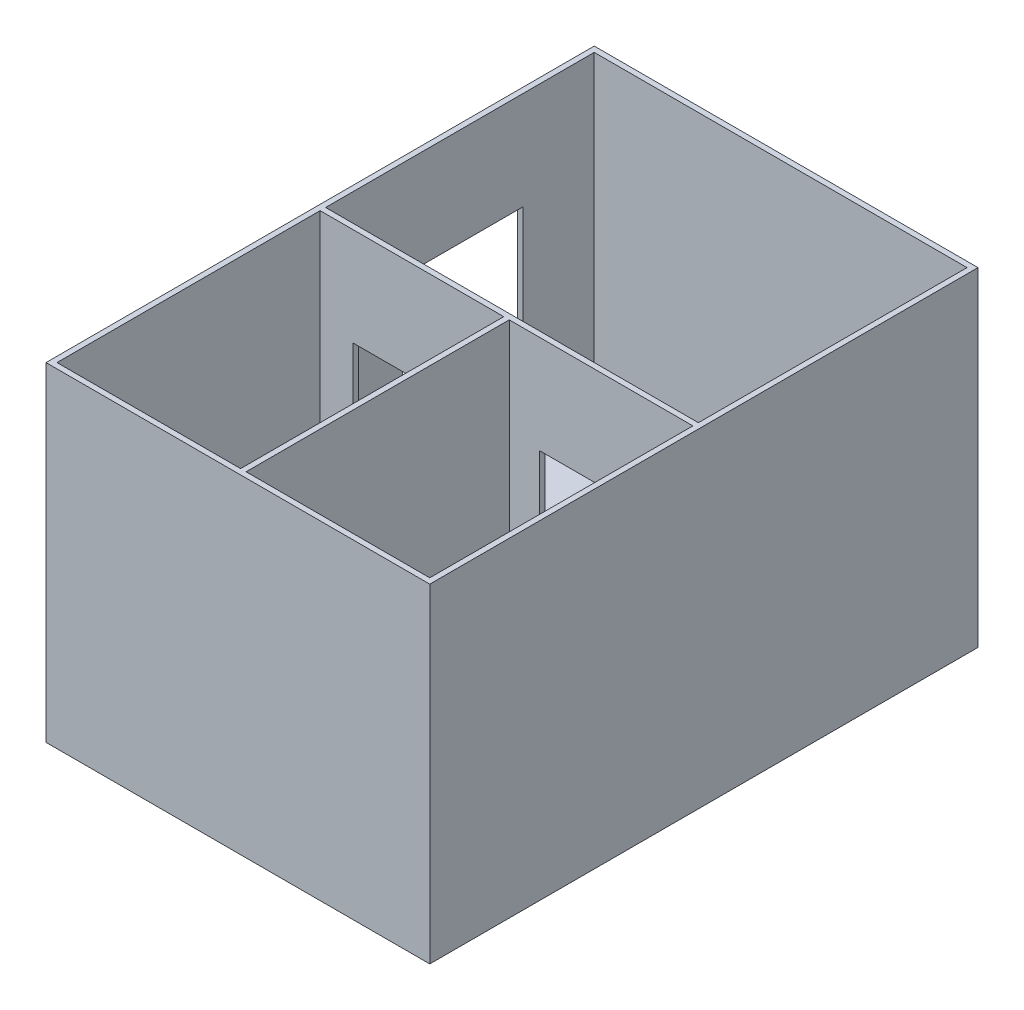
ISO-10303-21;
HEADER;
FILE_DESCRIPTION(('STEP AP214'),'2;1');
FILE_NAME('part.step','',(''),(''),'','','');
FILE_SCHEMA(('AUTOMOTIVE_DESIGN { 1 0 10303 214 1 1 1 1 }'));
ENDSEC;
DATA;
#1=APPLICATION_CONTEXT('core data for automotive mechanical design processes');
#2=APPLICATION_PROTOCOL_DEFINITION('international standard','automotive_design',2000,#1);
#3=PRODUCT_CONTEXT('',#1,'mechanical');
#4=PRODUCT('Part','Part','',(#3));
#5=PRODUCT_RELATED_PRODUCT_CATEGORY('part','',(#4));
#6=PRODUCT_DEFINITION_FORMATION('','',#4);
#7=PRODUCT_DEFINITION_CONTEXT('part definition',#1,'design');
#8=PRODUCT_DEFINITION('design','',#6,#7);
#9=PRODUCT_DEFINITION_SHAPE('','',#8);
#10=(LENGTH_UNIT() NAMED_UNIT(*) SI_UNIT(.MILLI.,.METRE.));
#11=(NAMED_UNIT(*) PLANE_ANGLE_UNIT() SI_UNIT($,.RADIAN.));
#12=(NAMED_UNIT(*) SI_UNIT($,.STERADIAN.) SOLID_ANGLE_UNIT());
#13=UNCERTAINTY_MEASURE_WITH_UNIT(LENGTH_MEASURE(1.E-05),#10,'distance_accuracy_value','');
#14=(GEOMETRIC_REPRESENTATION_CONTEXT(3) GLOBAL_UNCERTAINTY_ASSIGNED_CONTEXT((#13)) GLOBAL_UNIT_ASSIGNED_CONTEXT((#10,
#11,#12)) REPRESENTATION_CONTEXT('',''));
#15=CARTESIAN_POINT('',(0.,0.,0.));
#16=DIRECTION('',(0.,0.,1.));
#17=DIRECTION('',(1.,0.,0.));
#18=AXIS2_PLACEMENT_3D('',#15,#16,#17);
#19=CARTESIAN_POINT('',(1750.,0.,50.0000000000008));
#20=DIRECTION('',(0.,0.,-1.));
#21=DIRECTION('',(0.,1.,0.));
#22=AXIS2_PLACEMENT_3D('',#19,#20,#21);
#23=PLANE('',#22);
#24=DIRECTION('',(0.,-1.,0.));
#25=VECTOR('',#24,1.);
#26=CARTESIAN_POINT('',(300.,2105.,50.));
#27=LINE('',#26,#25);
#28=CARTESIAN_POINT('',(300.,2105.,50.));
#29=VERTEX_POINT('',#28);
#30=CARTESIAN_POINT('',(300.,49.9999999999998,50.));
#31=VERTEX_POINT('',#30);
#32=EDGE_CURVE('E344',#29,#31,#27,.T.);
#33=ORIENTED_EDGE('',*,*,#32,.F.);
#34=DIRECTION('',(1.,0.,0.));
#35=VECTOR('',#34,1.);
#36=CARTESIAN_POINT('',(300.,2105.,50.));
#37=LINE('',#36,#35);
#38=CARTESIAN_POINT('',(1400.,2105.,50.0000000000006));
#39=VERTEX_POINT('',#38);
#40=EDGE_CURVE('E339',#29,#39,#37,.T.);
#41=ORIENTED_EDGE('',*,*,#40,.T.);
#42=DIRECTION('',(0.,-1.,0.));
#43=VECTOR('',#42,1.);
#44=CARTESIAN_POINT('',(1400.,2105.,50.));
#45=LINE('',#44,#43);
#46=CARTESIAN_POINT('',(1400.,49.9999999999998,50.));
#47=VERTEX_POINT('',#46);
#48=EDGE_CURVE('E84',#39,#47,#45,.T.);
#49=ORIENTED_EDGE('',*,*,#48,.T.);
#50=DIRECTION('',(-1.,0.,0.));
#51=VECTOR('',#50,1.);
#52=CARTESIAN_POINT('',(0.,50.,50.0000000000008));
#53=LINE('',#52,#51);
#54=CARTESIAN_POINT('',(1700.,49.9999999999998,50.0000000000007));
#55=VERTEX_POINT('',#54);
#56=EDGE_CURVE('E12',#55,#47,#53,.T.);
#57=ORIENTED_EDGE('',*,*,#56,.F.);
#58=DIRECTION('',(0.,-1.,0.));
#59=VECTOR('',#58,1.);
#60=CARTESIAN_POINT('',(1700.,3000.,50.0000000000003));
#61=LINE('',#60,#59);
#62=CARTESIAN_POINT('',(1700.,3000.,50.0000000000003));
#63=VERTEX_POINT('',#62);
#64=EDGE_CURVE('E396',#63,#55,#61,.T.);
#65=ORIENTED_EDGE('',*,*,#64,.F.);
#66=DIRECTION('',(-1.,0.,0.));
#67=VECTOR('',#66,1.);
#68=CARTESIAN_POINT('',(1750.,3000.,50.0000000000005));
#69=LINE('',#68,#67);
#70=CARTESIAN_POINT('',(24.9999999999998,3000.,50.0000000000006));
#71=VERTEX_POINT('',#70);
#72=EDGE_CURVE('E388',#63,#71,#69,.T.);
#73=ORIENTED_EDGE('',*,*,#72,.T.);
#74=DIRECTION('',(0.,-1.,0.));
#75=VECTOR('',#74,1.);
#76=CARTESIAN_POINT('',(25.0000000000004,-2.13313163429281E-13,50.0000000000008));
#77=LINE('',#76,#75);
#78=CARTESIAN_POINT('',(25.0000000000002,50.,50.0000000000008));
#79=VERTEX_POINT('',#78);
#80=EDGE_CURVE('E368',#71,#79,#77,.T.);
#81=ORIENTED_EDGE('',*,*,#80,.T.);
#82=EDGE_CURVE('E647',#31,#79,#53,.T.);
#83=ORIENTED_EDGE('',*,*,#82,.F.);
#84=EDGE_LOOP('',(#33,#41,#49,#57,#65,#73,#81,#83));
#85=FACE_BOUND('',#84,.T.);
#86=ADVANCED_FACE('F59',(#85),#23,.F.);
#87=CARTESIAN_POINT('',(1750.,0.,4.44089209850063E-13));
#88=DIRECTION('',(0.,0.,-1.));
#89=DIRECTION('',(-1.,0.,0.));
#90=AXIS2_PLACEMENT_3D('',#87,#88,#89);
#91=PLANE('',#90);
#92=DIRECTION('',(0.,-1.,0.));
#93=VECTOR('',#92,1.);
#94=CARTESIAN_POINT('',(-300.,0.,0.));
#95=LINE('',#94,#93);
#96=CARTESIAN_POINT('',(-300.,2105.,0.));
#97=VERTEX_POINT('',#96);
#98=CARTESIAN_POINT('',(-300.,49.9999999999998,0.));
#99=VERTEX_POINT('',#98);
#100=EDGE_CURVE('E316',#97,#99,#95,.T.);
#101=ORIENTED_EDGE('',*,*,#100,.F.);
#102=DIRECTION('',(-1.,0.,0.));
#103=VECTOR('',#102,1.);
#104=CARTESIAN_POINT('',(0.,2105.,0.));
#105=LINE('',#104,#103);
#106=CARTESIAN_POINT('',(-1400.,2105.,0.));
#107=VERTEX_POINT('',#106);
#108=EDGE_CURVE('E284',#97,#107,#105,.T.);
#109=ORIENTED_EDGE('',*,*,#108,.T.);
#110=DIRECTION('',(0.,-1.,0.));
#111=VECTOR('',#110,1.);
#112=CARTESIAN_POINT('',(-1400.,1.48029736616688E-13,0.));
#113=LINE('',#112,#111);
#114=CARTESIAN_POINT('',(-1400.,50.,4.44089209850063E-13));
#115=VERTEX_POINT('',#114);
#116=EDGE_CURVE('E310',#107,#115,#113,.T.);
#117=ORIENTED_EDGE('',*,*,#116,.T.);
#118=DIRECTION('',(-1.,0.,0.));
#119=VECTOR('',#118,1.);
#120=CARTESIAN_POINT('',(0.,50.,4.44089209850063E-13));
#121=LINE('',#120,#119);
#122=CARTESIAN_POINT('',(-1700.,50.,4.44089209850063E-13));
#123=VERTEX_POINT('',#122);
#124=EDGE_CURVE('E501',#115,#123,#121,.T.);
#125=ORIENTED_EDGE('',*,*,#124,.T.);
#126=DIRECTION('',(0.,1.,0.));
#127=VECTOR('',#126,1.);
#128=CARTESIAN_POINT('',(-1700.,3000.,4.44089209850063E-13));
#129=LINE('',#128,#127);
#130=CARTESIAN_POINT('',(-1700.,3000.,4.44089209850063E-13));
#131=VERTEX_POINT('',#130);
#132=EDGE_CURVE('E393',#123,#131,#129,.T.);
#133=ORIENTED_EDGE('',*,*,#132,.T.);
#134=DIRECTION('',(-1.,0.,0.));
#135=VECTOR('',#134,1.);
#136=CARTESIAN_POINT('',(1750.,3000.,4.44089209850063E-13));
#137=LINE('',#136,#135);
#138=CARTESIAN_POINT('',(1700.,3000.,4.44089209850063E-13));
#139=VERTEX_POINT('',#138);
#140=EDGE_CURVE('E385',#139,#131,#137,.T.);
#141=ORIENTED_EDGE('',*,*,#140,.F.);
#142=DIRECTION('',(0.,-1.,0.));
#143=VECTOR('',#142,1.);
#144=CARTESIAN_POINT('',(1700.,3000.,4.44089209850063E-13));
#145=LINE('',#144,#143);
#146=CARTESIAN_POINT('',(1700.,49.9999999999998,4.44089209850063E-13));
#147=VERTEX_POINT('',#146);
#148=EDGE_CURVE('E387',#139,#147,#145,.T.);
#149=ORIENTED_EDGE('',*,*,#148,.T.);
#150=CARTESIAN_POINT('',(1400.,49.9999999999998,0.));
#151=VERTEX_POINT('',#150);
#152=EDGE_CURVE('E502',#147,#151,#121,.T.);
#153=ORIENTED_EDGE('',*,*,#152,.T.);
#154=DIRECTION('',(0.,-1.,0.));
#155=VECTOR('',#154,1.);
#156=CARTESIAN_POINT('',(1400.,2105.,0.));
#157=LINE('',#156,#155);
#158=CARTESIAN_POINT('',(1400.,2105.,0.));
#159=VERTEX_POINT('',#158);
#160=EDGE_CURVE('E345',#159,#151,#157,.T.);
#161=ORIENTED_EDGE('',*,*,#160,.F.);
#162=DIRECTION('',(1.,0.,0.));
#163=VECTOR('',#162,1.);
#164=CARTESIAN_POINT('',(300.,2105.,0.));
#165=LINE('',#164,#163);
#166=CARTESIAN_POINT('',(300.,2105.,4.44089209850063E-13));
#167=VERTEX_POINT('',#166);
#168=EDGE_CURVE('E340',#167,#159,#165,.T.);
#169=ORIENTED_EDGE('',*,*,#168,.F.);
#170=DIRECTION('',(0.,-1.,0.));
#171=VECTOR('',#170,1.);
#172=CARTESIAN_POINT('',(300.,2105.,0.));
#173=LINE('',#172,#171);
#174=CARTESIAN_POINT('',(300.,49.9999999999998,0.));
#175=VERTEX_POINT('',#174);
#176=EDGE_CURVE('E352',#167,#175,#173,.T.);
#177=ORIENTED_EDGE('',*,*,#176,.T.);
#178=EDGE_CURVE('E508',#175,#99,#121,.T.);
#179=ORIENTED_EDGE('',*,*,#178,.T.);
#180=EDGE_LOOP('',(#101,#109,#117,#125,#133,#141,#149,#153,#161,#169,#177,#179));
#181=FACE_BOUND('',#180,.T.);
#182=ADVANCED_FACE('F517',(#181),#91,.T.);
#183=CARTESIAN_POINT('',(0.,50.,0.));
#184=DIRECTION('',(0.,1.,0.));
#185=DIRECTION('',(0.,0.,1.));
#186=AXIS2_PLACEMENT_3D('',#183,#184,#185);
#187=PLANE('',#186);
#188=DIRECTION('',(0.,0.,1.));
#189=VECTOR('',#188,1.);
#190=CARTESIAN_POINT('',(-24.9999999999998,50.,0.));
#191=LINE('',#190,#189);
#192=CARTESIAN_POINT('',(-24.9999999999997,50.,50.0000000000008));
#193=VERTEX_POINT('',#192);
#194=CARTESIAN_POINT('',(-24.9999999999998,50.,2450.));
#195=VERTEX_POINT('',#194);
#196=EDGE_CURVE('E380',#193,#195,#191,.T.);
#197=ORIENTED_EDGE('',*,*,#196,.F.);
#198=CARTESIAN_POINT('',(-300.,50.,50.));
#199=VERTEX_POINT('',#198);
#200=EDGE_CURVE('E69',#193,#199,#53,.T.);
#201=ORIENTED_EDGE('',*,*,#200,.T.);
#202=CARTESIAN_POINT('',(-1400.,50.,50.));
#203=VERTEX_POINT('',#202);
#204=EDGE_CURVE('E507',#199,#203,#53,.T.);
#205=ORIENTED_EDGE('',*,*,#204,.T.);
#206=CARTESIAN_POINT('',(-1700.,49.9999999999998,50.0000000000007));
#207=VERTEX_POINT('',#206);
#208=EDGE_CURVE('E68',#203,#207,#53,.T.);
#209=ORIENTED_EDGE('',*,*,#208,.T.);
#210=DIRECTION('',(0.,0.,1.));
#211=VECTOR('',#210,1.);
#212=CARTESIAN_POINT('',(-1700.,49.9999999999998,2500.));
#213=LINE('',#212,#211);
#214=CARTESIAN_POINT('',(-1700.,50.,2450.));
#215=VERTEX_POINT('',#214);
#216=EDGE_CURVE('E426',#207,#215,#213,.T.);
#217=ORIENTED_EDGE('',*,*,#216,.T.);
#218=DIRECTION('',(1.,0.,0.));
#219=VECTOR('',#218,1.);
#220=CARTESIAN_POINT('',(1750.,49.9999999999998,2450.));
#221=LINE('',#220,#219);
#222=EDGE_CURVE('E448',#215,#195,#221,.T.);
#223=ORIENTED_EDGE('',*,*,#222,.T.);
#224=EDGE_LOOP('',(#197,#201,#205,#209,#217,#223));
#225=FACE_BOUND('',#224,.T.);
#226=ADVANCED_FACE('F598',(#225),#187,.T.);
#227=CARTESIAN_POINT('',(1750.,3000.,2450.));
#228=DIRECTION('',(0.,0.,-1.));
#229=DIRECTION('',(-1.,0.,0.));
#230=AXIS2_PLACEMENT_3D('',#227,#228,#229);
#231=PLANE('',#230);
#232=DIRECTION('',(0.,1.,0.));
#233=VECTOR('',#232,1.);
#234=CARTESIAN_POINT('',(-25.0000000000001,3000.,2450.));
#235=LINE('',#234,#233);
#236=CARTESIAN_POINT('',(-25.0000000000002,3000.,2450.));
#237=VERTEX_POINT('',#236);
#238=EDGE_CURVE('E382',#195,#237,#235,.T.);
#239=ORIENTED_EDGE('',*,*,#238,.F.);
#240=ORIENTED_EDGE('',*,*,#222,.F.);
#241=DIRECTION('',(0.,-1.,0.));
#242=VECTOR('',#241,1.);
#243=CARTESIAN_POINT('',(-1700.,3000.,2450.));
#244=LINE('',#243,#242);
#245=CARTESIAN_POINT('',(-1700.,3000.,2450.));
#246=VERTEX_POINT('',#245);
#247=EDGE_CURVE('E438',#246,#215,#244,.T.);
#248=ORIENTED_EDGE('',*,*,#247,.F.);
#249=DIRECTION('',(1.,0.,0.));
#250=VECTOR('',#249,1.);
#251=CARTESIAN_POINT('',(1750.,3000.,2450.));
#252=LINE('',#251,#250);
#253=EDGE_CURVE('E466',#246,#237,#252,.T.);
#254=ORIENTED_EDGE('',*,*,#253,.T.);
#255=EDGE_LOOP('',(#239,#240,#248,#254));
#256=FACE_BOUND('',#255,.T.);
#257=ADVANCED_FACE('F604',(#256),#231,.T.);
#258=DIRECTION('',(-1.,0.,0.));
#259=VECTOR('',#258,1.);
#260=CARTESIAN_POINT('',(0.,2105.,50.));
#261=LINE('',#260,#259);
#262=CARTESIAN_POINT('',(-300.,2105.,50.));
#263=VERTEX_POINT('',#262);
#264=CARTESIAN_POINT('',(-1400.,2105.,50.0000000000006));
#265=VERTEX_POINT('',#264);
#266=EDGE_CURVE('E281',#263,#265,#261,.T.);
#267=ORIENTED_EDGE('',*,*,#266,.F.);
#268=DIRECTION('',(0.,-1.,0.));
#269=VECTOR('',#268,1.);
#270=CARTESIAN_POINT('',(-300.,0.,50.));
#271=LINE('',#270,#269);
#272=EDGE_CURVE('E292',#263,#199,#271,.T.);
#273=ORIENTED_EDGE('',*,*,#272,.T.);
#274=ORIENTED_EDGE('',*,*,#200,.F.);
#275=DIRECTION('',(0.,1.,0.));
#276=VECTOR('',#275,1.);
#277=CARTESIAN_POINT('',(-24.9999999999997,-2.11462791721573E-13,50.0000000000008));
#278=LINE('',#277,#276);
#279=CARTESIAN_POINT('',(-25.0000000000002,3000.,50.0000000000005));
#280=VERTEX_POINT('',#279);
#281=EDGE_CURVE('E377',#193,#280,#278,.T.);
#282=ORIENTED_EDGE('',*,*,#281,.T.);
#283=CARTESIAN_POINT('',(-1700.,3000.,50.0000000000003));
#284=VERTEX_POINT('',#283);
#285=EDGE_CURVE('E384',#280,#284,#69,.T.);
#286=ORIENTED_EDGE('',*,*,#285,.T.);
#287=DIRECTION('',(0.,1.,0.));
#288=VECTOR('',#287,1.);
#289=CARTESIAN_POINT('',(-1700.,3000.,50.0000000000003));
#290=LINE('',#289,#288);
#291=EDGE_CURVE('E398',#207,#284,#290,.T.);
#292=ORIENTED_EDGE('',*,*,#291,.F.);
#293=ORIENTED_EDGE('',*,*,#208,.F.);
#294=DIRECTION('',(0.,-1.,0.));
#295=VECTOR('',#294,1.);
#296=CARTESIAN_POINT('',(-1400.,1.48029736616688E-13,50.));
#297=LINE('',#296,#295);
#298=EDGE_CURVE('E303',#265,#203,#297,.T.);
#299=ORIENTED_EDGE('',*,*,#298,.F.);
#300=EDGE_LOOP('',(#267,#273,#274,#282,#286,#292,#293,#299));
#301=FACE_BOUND('',#300,.T.);
#302=ADVANCED_FACE('F301',(#301),#23,.F.);
#303=CARTESIAN_POINT('',(-1700.,3000.,2500.));
#304=DIRECTION('',(1.,0.,0.));
#305=DIRECTION('',(0.,0.,-1.));
#306=AXIS2_PLACEMENT_3D('',#303,#304,#305);
#307=PLANE('',#306);
#308=ORIENTED_EDGE('',*,*,#216,.F.);
#309=ORIENTED_EDGE('',*,*,#291,.T.);
#310=DIRECTION('',(0.,0.,1.));
#311=VECTOR('',#310,1.);
#312=CARTESIAN_POINT('',(-1700.,3000.,2500.));
#313=LINE('',#312,#311);
#314=EDGE_CURVE('E461',#284,#246,#313,.T.);
#315=ORIENTED_EDGE('',*,*,#314,.T.);
#316=ORIENTED_EDGE('',*,*,#247,.T.);
#317=EDGE_LOOP('',(#308,#309,#315,#316));
#318=FACE_BOUND('',#317,.T.);
#319=ADVANCED_FACE('F603',(#318),#307,.T.);
#320=CARTESIAN_POINT('',(1700.,3000.,2500.));
#321=DIRECTION('',(-1.,0.,0.));
#322=DIRECTION('',(0.,0.,1.));
#323=AXIS2_PLACEMENT_3D('',#320,#321,#322);
#324=PLANE('',#323);
#325=DIRECTION('',(0.,0.,-1.));
#326=VECTOR('',#325,1.);
#327=CARTESIAN_POINT('',(1700.,3000.,2500.));
#328=LINE('',#327,#326);
#329=CARTESIAN_POINT('',(1700.,3000.,2450.));
#330=VERTEX_POINT('',#329);
#331=EDGE_CURVE('E470',#330,#63,#328,.T.);
#332=ORIENTED_EDGE('',*,*,#331,.T.);
#333=ORIENTED_EDGE('',*,*,#64,.T.);
#334=DIRECTION('',(0.,0.,-1.));
#335=VECTOR('',#334,1.);
#336=CARTESIAN_POINT('',(1700.,49.9999999999998,2500.));
#337=LINE('',#336,#335);
#338=CARTESIAN_POINT('',(1700.,50.,2450.));
#339=VERTEX_POINT('',#338);
#340=EDGE_CURVE('E454',#339,#55,#337,.T.);
#341=ORIENTED_EDGE('',*,*,#340,.F.);
#342=DIRECTION('',(0.,-1.,0.));
#343=VECTOR('',#342,1.);
#344=CARTESIAN_POINT('',(1700.,3000.,2450.));
#345=LINE('',#344,#343);
#346=EDGE_CURVE('E442',#330,#339,#345,.T.);
#347=ORIENTED_EDGE('',*,*,#346,.F.);
#348=EDGE_LOOP('',(#332,#333,#341,#347));
#349=FACE_BOUND('',#348,.T.);
#350=ADVANCED_FACE('F609',(#349),#324,.T.);
#351=DIRECTION('',(0.,0.,-1.));
#352=VECTOR('',#351,1.);
#353=CARTESIAN_POINT('',(25.0000000000002,50.,0.));
#354=LINE('',#353,#352);
#355=CARTESIAN_POINT('',(25.0000000000002,50.,2450.));
#356=VERTEX_POINT('',#355);
#357=EDGE_CURVE('E372',#356,#79,#354,.T.);
#358=ORIENTED_EDGE('',*,*,#357,.F.);
#359=EDGE_CURVE('E436',#356,#339,#221,.T.);
#360=ORIENTED_EDGE('',*,*,#359,.T.);
#361=ORIENTED_EDGE('',*,*,#340,.T.);
#362=ORIENTED_EDGE('',*,*,#56,.T.);
#363=EDGE_CURVE('E67',#47,#31,#53,.T.);
#364=ORIENTED_EDGE('',*,*,#363,.T.);
#365=ORIENTED_EDGE('',*,*,#82,.T.);
#366=EDGE_LOOP('',(#358,#360,#361,#362,#364,#365));
#367=FACE_BOUND('',#366,.T.);
#368=ADVANCED_FACE('F620',(#367),#187,.T.);
#369=CARTESIAN_POINT('',(-1750.,3000.,2500.));
#370=DIRECTION('',(1.,0.,0.));
#371=DIRECTION('',(0.,0.,-1.));
#372=AXIS2_PLACEMENT_3D('',#369,#370,#371);
#373=PLANE('',#372);
#374=DIRECTION('',(0.,0.,1.));
#375=VECTOR('',#374,1.);
#376=CARTESIAN_POINT('',(-1750.,0.,2500.));
#377=LINE('',#376,#375);
#378=CARTESIAN_POINT('',(-1750.,0.,-699.999999999999));
#379=VERTEX_POINT('',#378);
#380=CARTESIAN_POINT('',(-1750.,0.,2500.));
#381=VERTEX_POINT('',#380);
#382=EDGE_CURVE('E441',#379,#381,#377,.T.);
#383=ORIENTED_EDGE('',*,*,#382,.T.);
#384=DIRECTION('',(0.,-1.,0.));
#385=VECTOR('',#384,1.);
#386=CARTESIAN_POINT('',(-1750.,3000.,2500.));
#387=LINE('',#386,#385);
#388=CARTESIAN_POINT('',(-1750.,3000.,2500.));
#389=VERTEX_POINT('',#388);
#390=EDGE_CURVE('E499',#389,#381,#387,.T.);
#391=ORIENTED_EDGE('',*,*,#390,.F.);
#392=DIRECTION('',(0.,0.,1.));
#393=VECTOR('',#392,1.);
#394=CARTESIAN_POINT('',(-1750.,3000.,2500.));
#395=LINE('',#394,#393);
#396=CARTESIAN_POINT('',(-1750.,3000.,-2500.));
#397=VERTEX_POINT('',#396);
#398=EDGE_CURVE('E473',#397,#389,#395,.T.);
#399=ORIENTED_EDGE('',*,*,#398,.F.);
#400=DIRECTION('',(0.,-1.,0.));
#401=VECTOR('',#400,1.);
#402=CARTESIAN_POINT('',(-1750.,3000.,-2500.));
#403=LINE('',#402,#401);
#404=CARTESIAN_POINT('',(-1750.,0.,-2500.));
#405=VERTEX_POINT('',#404);
#406=EDGE_CURVE('E482',#397,#405,#403,.T.);
#407=ORIENTED_EDGE('',*,*,#406,.T.);
#408=CARTESIAN_POINT('',(-1750.,0.,-1800.));
#409=VERTEX_POINT('',#408);
#410=EDGE_CURVE('E483',#405,#409,#377,.T.);
#411=ORIENTED_EDGE('',*,*,#410,.T.);
#412=DIRECTION('',(0.,1.,0.));
#413=VECTOR('',#412,1.);
#414=CARTESIAN_POINT('',(-1750.,0.,-1800.));
#415=LINE('',#414,#413);
#416=CARTESIAN_POINT('',(-1750.,2105.,-1800.));
#417=VERTEX_POINT('',#416);
#418=EDGE_CURVE('E401',#409,#417,#415,.T.);
#419=ORIENTED_EDGE('',*,*,#418,.T.);
#420=DIRECTION('',(0.,0.,-1.));
#421=VECTOR('',#420,1.);
#422=CARTESIAN_POINT('',(-1750.,2105.,0.));
#423=LINE('',#422,#421);
#424=CARTESIAN_POINT('',(-1750.,2105.,-699.999999999999));
#425=VERTEX_POINT('',#424);
#426=EDGE_CURVE('E421',#425,#417,#423,.T.);
#427=ORIENTED_EDGE('',*,*,#426,.F.);
#428=DIRECTION('',(0.,1.,0.));
#429=VECTOR('',#428,1.);
#430=CARTESIAN_POINT('',(-1750.,0.,-699.999999999999));
#431=LINE('',#430,#429);
#432=EDGE_CURVE('E418',#379,#425,#431,.T.);
#433=ORIENTED_EDGE('',*,*,#432,.F.);
#434=EDGE_LOOP('',(#383,#391,#399,#407,#411,#419,#427,#433));
#435=FACE_BOUND('',#434,.T.);
#436=ADVANCED_FACE('F61',(#435),#373,.F.);
#437=CARTESIAN_POINT('',(0.,0.,0.));
#438=DIRECTION('',(0.,1.,0.));
#439=DIRECTION('',(0.,0.,1.));
#440=AXIS2_PLACEMENT_3D('',#437,#438,#439);
#441=PLANE('',#440);
#442=DIRECTION('',(0.,0.,-1.));
#443=VECTOR('',#442,1.);
#444=CARTESIAN_POINT('',(1750.,0.,2500.));
#445=LINE('',#444,#443);
#446=CARTESIAN_POINT('',(1750.,0.,2500.));
#447=VERTEX_POINT('',#446);
#448=CARTESIAN_POINT('',(1750.,0.,-2500.));
#449=VERTEX_POINT('',#448);
#450=EDGE_CURVE('E488',#447,#449,#445,.T.);
#451=ORIENTED_EDGE('',*,*,#450,.F.);
#452=DIRECTION('',(1.,0.,0.));
#453=VECTOR('',#452,1.);
#454=CARTESIAN_POINT('',(1750.,0.,2500.));
#455=LINE('',#454,#453);
#456=EDGE_CURVE('E486',#381,#447,#455,.T.);
#457=ORIENTED_EDGE('',*,*,#456,.F.);
#458=ORIENTED_EDGE('',*,*,#382,.F.);
#459=DIRECTION('',(-1.,0.,0.));
#460=VECTOR('',#459,1.);
#461=CARTESIAN_POINT('',(-1700.,0.,-699.999999999999));
#462=LINE('',#461,#460);
#463=CARTESIAN_POINT('',(-1700.,0.,-699.999999999999));
#464=VERTEX_POINT('',#463);
#465=EDGE_CURVE('E429',#464,#379,#462,.T.);
#466=ORIENTED_EDGE('',*,*,#465,.F.);
#467=DIRECTION('',(0.,0.,1.));
#468=VECTOR('',#467,1.);
#469=CARTESIAN_POINT('',(-1700.,0.,0.));
#470=LINE('',#469,#468);
#471=CARTESIAN_POINT('',(-1700.,0.,-1800.));
#472=VERTEX_POINT('',#471);
#473=EDGE_CURVE('E405',#472,#464,#470,.T.);
#474=ORIENTED_EDGE('',*,*,#473,.F.);
#475=DIRECTION('',(-1.,0.,0.));
#476=VECTOR('',#475,1.);
#477=CARTESIAN_POINT('',(-1700.,0.,-1800.));
#478=LINE('',#477,#476);
#479=EDGE_CURVE('E415',#472,#409,#478,.T.);
#480=ORIENTED_EDGE('',*,*,#479,.T.);
#481=ORIENTED_EDGE('',*,*,#410,.F.);
#482=DIRECTION('',(-1.,0.,0.));
#483=VECTOR('',#482,1.);
#484=CARTESIAN_POINT('',(1750.,0.,-2500.));
#485=LINE('',#484,#483);
#486=EDGE_CURVE('E476',#449,#405,#485,.T.);
#487=ORIENTED_EDGE('',*,*,#486,.F.);
#488=EDGE_LOOP('',(#451,#457,#458,#466,#474,#480,#481,#487));
#489=FACE_BOUND('',#488,.T.);
#490=ADVANCED_FACE('F559',(#489),#441,.F.);
#491=ORIENTED_EDGE('',*,*,#132,.F.);
#492=CARTESIAN_POINT('',(-1700.,49.9999999999998,-699.999999999999));
#493=VERTEX_POINT('',#492);
#494=EDGE_CURVE('E524',#493,#123,#213,.T.);
#495=ORIENTED_EDGE('',*,*,#494,.F.);
#496=DIRECTION('',(0.,1.,0.));
#497=VECTOR('',#496,1.);
#498=CARTESIAN_POINT('',(-1700.,0.,-699.999999999999));
#499=LINE('',#498,#497);
#500=CARTESIAN_POINT('',(-1700.,2105.,-699.999999999999));
#501=VERTEX_POINT('',#500);
#502=EDGE_CURVE('E409',#493,#501,#499,.T.);
#503=ORIENTED_EDGE('',*,*,#502,.T.);
#504=DIRECTION('',(0.,0.,-1.));
#505=VECTOR('',#504,1.);
#506=CARTESIAN_POINT('',(-1700.,2105.,0.));
#507=LINE('',#506,#505);
#508=CARTESIAN_POINT('',(-1700.,2105.,-1800.));
#509=VERTEX_POINT('',#508);
#510=EDGE_CURVE('E412',#501,#509,#507,.T.);
#511=ORIENTED_EDGE('',*,*,#510,.T.);
#512=DIRECTION('',(0.,1.,0.));
#513=VECTOR('',#512,1.);
#514=CARTESIAN_POINT('',(-1700.,0.,-1800.));
#515=LINE('',#514,#513);
#516=CARTESIAN_POINT('',(-1700.,50.,-1800.));
#517=VERTEX_POINT('',#516);
#518=EDGE_CURVE('E406',#517,#509,#515,.T.);
#519=ORIENTED_EDGE('',*,*,#518,.F.);
#520=CARTESIAN_POINT('',(-1700.,50.,-2450.));
#521=VERTEX_POINT('',#520);
#522=EDGE_CURVE('E433',#521,#517,#213,.T.);
#523=ORIENTED_EDGE('',*,*,#522,.F.);
#524=DIRECTION('',(0.,-1.,0.));
#525=VECTOR('',#524,1.);
#526=CARTESIAN_POINT('',(-1700.,3000.,-2450.));
#527=LINE('',#526,#525);
#528=CARTESIAN_POINT('',(-1700.,3000.,-2450.));
#529=VERTEX_POINT('',#528);
#530=EDGE_CURVE('E443',#529,#521,#527,.T.);
#531=ORIENTED_EDGE('',*,*,#530,.F.);
#532=EDGE_CURVE('E462',#529,#131,#313,.T.);
#533=ORIENTED_EDGE('',*,*,#532,.T.);
#534=EDGE_LOOP('',(#491,#495,#503,#511,#519,#523,#531,#533));
#535=FACE_BOUND('',#534,.T.);
#536=ADVANCED_FACE('F528',(#535),#307,.T.);
#537=CARTESIAN_POINT('',(1750.,3000.,2500.));
#538=DIRECTION('',(0.,0.,-1.));
#539=DIRECTION('',(-1.,0.,0.));
#540=AXIS2_PLACEMENT_3D('',#537,#538,#539);
#541=PLANE('',#540);
#542=DIRECTION('',(0.,-1.,0.));
#543=VECTOR('',#542,1.);
#544=CARTESIAN_POINT('',(1750.,3000.,2500.));
#545=LINE('',#544,#543);
#546=CARTESIAN_POINT('',(1750.,3000.,2500.));
#547=VERTEX_POINT('',#546);
#548=EDGE_CURVE('E496',#547,#447,#545,.T.);
#549=ORIENTED_EDGE('',*,*,#548,.F.);
#550=DIRECTION('',(1.,0.,0.));
#551=VECTOR('',#550,1.);
#552=CARTESIAN_POINT('',(1750.,3000.,2500.));
#553=LINE('',#552,#551);
#554=EDGE_CURVE('E475',#389,#547,#553,.T.);
#555=ORIENTED_EDGE('',*,*,#554,.F.);
#556=ORIENTED_EDGE('',*,*,#390,.T.);
#557=ORIENTED_EDGE('',*,*,#456,.T.);
#558=EDGE_LOOP('',(#549,#555,#556,#557));
#559=FACE_BOUND('',#558,.T.);
#560=ADVANCED_FACE('F573',(#559),#541,.F.);
#561=CARTESIAN_POINT('',(1750.,3000.,2500.));
#562=DIRECTION('',(-1.,0.,0.));
#563=DIRECTION('',(0.,0.,1.));
#564=AXIS2_PLACEMENT_3D('',#561,#562,#563);
#565=PLANE('',#564);
#566=DIRECTION('',(0.,-1.,0.));
#567=VECTOR('',#566,1.);
#568=CARTESIAN_POINT('',(1750.,3000.,-2500.));
#569=LINE('',#568,#567);
#570=CARTESIAN_POINT('',(1750.,3000.,-2500.));
#571=VERTEX_POINT('',#570);
#572=EDGE_CURVE('E493',#571,#449,#569,.T.);
#573=ORIENTED_EDGE('',*,*,#572,.F.);
#574=DIRECTION('',(0.,0.,-1.));
#575=VECTOR('',#574,1.);
#576=CARTESIAN_POINT('',(1750.,3000.,2500.));
#577=LINE('',#576,#575);
#578=EDGE_CURVE('E478',#547,#571,#577,.T.);
#579=ORIENTED_EDGE('',*,*,#578,.F.);
#580=ORIENTED_EDGE('',*,*,#548,.T.);
#581=ORIENTED_EDGE('',*,*,#450,.T.);
#582=EDGE_LOOP('',(#573,#579,#580,#581));
#583=FACE_BOUND('',#582,.T.);
#584=ADVANCED_FACE('F584',(#583),#565,.F.);
#585=CARTESIAN_POINT('',(1750.,3000.,-2500.));
#586=DIRECTION('',(0.,0.,1.));
#587=DIRECTION('',(1.,0.,0.));
#588=AXIS2_PLACEMENT_3D('',#585,#586,#587);
#589=PLANE('',#588);
#590=ORIENTED_EDGE('',*,*,#486,.T.);
#591=ORIENTED_EDGE('',*,*,#406,.F.);
#592=DIRECTION('',(-1.,0.,0.));
#593=VECTOR('',#592,1.);
#594=CARTESIAN_POINT('',(1750.,3000.,-2500.));
#595=LINE('',#594,#593);
#596=EDGE_CURVE('E480',#571,#397,#595,.T.);
#597=ORIENTED_EDGE('',*,*,#596,.F.);
#598=ORIENTED_EDGE('',*,*,#572,.T.);
#599=EDGE_LOOP('',(#590,#591,#597,#598));
#600=FACE_BOUND('',#599,.T.);
#601=ADVANCED_FACE('F582',(#600),#589,.F.);
#602=CARTESIAN_POINT('',(0.,3000.,0.));
#603=DIRECTION('',(0.,1.,0.));
#604=DIRECTION('',(0.,0.,1.));
#605=AXIS2_PLACEMENT_3D('',#602,#603,#604);
#606=PLANE('',#605);
#607=ORIENTED_EDGE('',*,*,#285,.F.);
#608=DIRECTION('',(0.,0.,1.));
#609=VECTOR('',#608,1.);
#610=CARTESIAN_POINT('',(-25.0000000000002,3000.,4.44089209850063E-13));
#611=LINE('',#610,#609);
#612=EDGE_CURVE('E365',#280,#237,#611,.T.);
#613=ORIENTED_EDGE('',*,*,#612,.T.);
#614=ORIENTED_EDGE('',*,*,#253,.F.);
#615=ORIENTED_EDGE('',*,*,#314,.F.);
#616=EDGE_LOOP('',(#607,#613,#614,#615));
#617=FACE_BOUND('',#616,.T.);
#618=ORIENTED_EDGE('',*,*,#554,.T.);
#619=ORIENTED_EDGE('',*,*,#578,.T.);
#620=ORIENTED_EDGE('',*,*,#596,.T.);
#621=ORIENTED_EDGE('',*,*,#398,.T.);
#622=EDGE_LOOP('',(#618,#619,#620,#621));
#623=FACE_BOUND('',#622,.T.);
#624=CARTESIAN_POINT('',(24.9999999999998,3000.,2450.));
#625=VERTEX_POINT('',#624);
#626=EDGE_CURVE('E465',#625,#330,#252,.T.);
#627=ORIENTED_EDGE('',*,*,#626,.F.);
#628=DIRECTION('',(0.,0.,1.));
#629=VECTOR('',#628,1.);
#630=CARTESIAN_POINT('',(24.9999999999998,3000.,4.44089209850063E-13));
#631=LINE('',#630,#629);
#632=EDGE_CURVE('E324',#71,#625,#631,.T.);
#633=ORIENTED_EDGE('',*,*,#632,.F.);
#634=ORIENTED_EDGE('',*,*,#72,.F.);
#635=ORIENTED_EDGE('',*,*,#331,.F.);
#636=EDGE_LOOP('',(#627,#633,#634,#635));
#637=FACE_BOUND('',#636,.T.);
#638=ORIENTED_EDGE('',*,*,#140,.T.);
#639=ORIENTED_EDGE('',*,*,#532,.F.);
#640=DIRECTION('',(-1.,0.,0.));
#641=VECTOR('',#640,1.);
#642=CARTESIAN_POINT('',(1750.,3000.,-2450.));
#643=LINE('',#642,#641);
#644=CARTESIAN_POINT('',(1700.,3000.,-2450.));
#645=VERTEX_POINT('',#644);
#646=EDGE_CURVE('E447',#645,#529,#643,.T.);
#647=ORIENTED_EDGE('',*,*,#646,.F.);
#648=EDGE_CURVE('E469',#139,#645,#328,.T.);
#649=ORIENTED_EDGE('',*,*,#648,.F.);
#650=EDGE_LOOP('',(#638,#639,#647,#649));
#651=FACE_BOUND('',#650,.T.);
#652=ADVANCED_FACE('F534',(#617,#623,#637,#651),#606,.T.);
#653=DIRECTION('',(0.,-1.,0.));
#654=VECTOR('',#653,1.);
#655=CARTESIAN_POINT('',(24.9999999999999,3000.,2450.));
#656=LINE('',#655,#654);
#657=EDGE_CURVE('E375',#625,#356,#656,.T.);
#658=ORIENTED_EDGE('',*,*,#657,.F.);
#659=ORIENTED_EDGE('',*,*,#626,.T.);
#660=ORIENTED_EDGE('',*,*,#346,.T.);
#661=ORIENTED_EDGE('',*,*,#359,.F.);
#662=EDGE_LOOP('',(#658,#659,#660,#661));
#663=FACE_BOUND('',#662,.T.);
#664=ADVANCED_FACE('F614',(#663),#231,.T.);
#665=ORIENTED_EDGE('',*,*,#148,.F.);
#666=ORIENTED_EDGE('',*,*,#648,.T.);
#667=DIRECTION('',(0.,-1.,0.));
#668=VECTOR('',#667,1.);
#669=CARTESIAN_POINT('',(1700.,3000.,-2450.));
#670=LINE('',#669,#668);
#671=CARTESIAN_POINT('',(1700.,50.,-2450.));
#672=VERTEX_POINT('',#671);
#673=EDGE_CURVE('E446',#645,#672,#670,.T.);
#674=ORIENTED_EDGE('',*,*,#673,.T.);
#675=EDGE_CURVE('E451',#147,#672,#337,.T.);
#676=ORIENTED_EDGE('',*,*,#675,.F.);
#677=EDGE_LOOP('',(#665,#666,#674,#676));
#678=FACE_BOUND('',#677,.T.);
#679=ADVANCED_FACE('F538',(#678),#324,.T.);
#680=CARTESIAN_POINT('',(1750.,3000.,-2450.));
#681=DIRECTION('',(0.,0.,1.));
#682=DIRECTION('',(1.,0.,0.));
#683=AXIS2_PLACEMENT_3D('',#680,#681,#682);
#684=PLANE('',#683);
#685=DIRECTION('',(-1.,0.,0.));
#686=VECTOR('',#685,1.);
#687=CARTESIAN_POINT('',(1750.,49.9999999999998,-2450.));
#688=LINE('',#687,#686);
#689=EDGE_CURVE('E457',#672,#521,#688,.T.);
#690=ORIENTED_EDGE('',*,*,#689,.F.);
#691=ORIENTED_EDGE('',*,*,#673,.F.);
#692=ORIENTED_EDGE('',*,*,#646,.T.);
#693=ORIENTED_EDGE('',*,*,#530,.T.);
#694=EDGE_LOOP('',(#690,#691,#692,#693));
#695=FACE_BOUND('',#694,.T.);
#696=ADVANCED_FACE('F542',(#695),#684,.T.);
#697=ORIENTED_EDGE('',*,*,#152,.F.);
#698=ORIENTED_EDGE('',*,*,#675,.T.);
#699=ORIENTED_EDGE('',*,*,#689,.T.);
#700=ORIENTED_EDGE('',*,*,#522,.T.);
#701=EDGE_CURVE('E437',#517,#493,#213,.T.);
#702=ORIENTED_EDGE('',*,*,#701,.T.);
#703=ORIENTED_EDGE('',*,*,#494,.T.);
#704=ORIENTED_EDGE('',*,*,#124,.F.);
#705=EDGE_CURVE('E509',#99,#115,#121,.T.);
#706=ORIENTED_EDGE('',*,*,#705,.F.);
#707=ORIENTED_EDGE('',*,*,#178,.F.);
#708=EDGE_CURVE('E504',#151,#175,#121,.T.);
#709=ORIENTED_EDGE('',*,*,#708,.F.);
#710=EDGE_LOOP('',(#697,#698,#699,#700,#702,#703,#704,#706,#707,#709));
#711=FACE_BOUND('',#710,.T.);
#712=ADVANCED_FACE('F521',(#711),#187,.T.);
#713=CARTESIAN_POINT('',(-1700.,0.,-1800.));
#714=DIRECTION('',(0.,0.,1.));
#715=DIRECTION('',(1.,0.,0.));
#716=AXIS2_PLACEMENT_3D('',#713,#714,#715);
#717=PLANE('',#716);
#718=ORIENTED_EDGE('',*,*,#418,.F.);
#719=ORIENTED_EDGE('',*,*,#479,.F.);
#720=EDGE_CURVE('E402',#472,#517,#515,.T.);
#721=ORIENTED_EDGE('',*,*,#720,.T.);
#722=ORIENTED_EDGE('',*,*,#518,.T.);
#723=DIRECTION('',(-1.,0.,0.));
#724=VECTOR('',#723,1.);
#725=CARTESIAN_POINT('',(-1700.,2105.,-1800.));
#726=LINE('',#725,#724);
#727=EDGE_CURVE('E424',#509,#417,#726,.T.);
#728=ORIENTED_EDGE('',*,*,#727,.T.);
#729=EDGE_LOOP('',(#718,#719,#721,#722,#728));
#730=FACE_BOUND('',#729,.T.);
#731=ADVANCED_FACE('F548',(#730),#717,.T.);
#732=CARTESIAN_POINT('',(-1700.,2105.,0.));
#733=DIRECTION('',(0.,1.,0.));
#734=DIRECTION('',(0.,0.,1.));
#735=AXIS2_PLACEMENT_3D('',#732,#733,#734);
#736=PLANE('',#735);
#737=ORIENTED_EDGE('',*,*,#426,.T.);
#738=ORIENTED_EDGE('',*,*,#727,.F.);
#739=ORIENTED_EDGE('',*,*,#510,.F.);
#740=DIRECTION('',(-1.,0.,0.));
#741=VECTOR('',#740,1.);
#742=CARTESIAN_POINT('',(-1700.,2105.,-699.999999999999));
#743=LINE('',#742,#741);
#744=EDGE_CURVE('E427',#501,#425,#743,.T.);
#745=ORIENTED_EDGE('',*,*,#744,.T.);
#746=EDGE_LOOP('',(#737,#738,#739,#745));
#747=FACE_BOUND('',#746,.T.);
#748=ADVANCED_FACE('F551',(#747),#736,.F.);
#749=CARTESIAN_POINT('',(-1700.,0.,-699.999999999999));
#750=DIRECTION('',(0.,0.,1.));
#751=DIRECTION('',(1.,0.,0.));
#752=AXIS2_PLACEMENT_3D('',#749,#750,#751);
#753=PLANE('',#752);
#754=ORIENTED_EDGE('',*,*,#432,.T.);
#755=ORIENTED_EDGE('',*,*,#744,.F.);
#756=ORIENTED_EDGE('',*,*,#502,.F.);
#757=EDGE_CURVE('E410',#464,#493,#499,.T.);
#758=ORIENTED_EDGE('',*,*,#757,.F.);
#759=ORIENTED_EDGE('',*,*,#465,.T.);
#760=EDGE_LOOP('',(#754,#755,#756,#758,#759));
#761=FACE_BOUND('',#760,.T.);
#762=ADVANCED_FACE('F567',(#761),#753,.F.);
#763=CARTESIAN_POINT('',(-1700.,0.,0.));
#764=DIRECTION('',(-1.,0.,0.));
#765=DIRECTION('',(0.,0.,1.));
#766=AXIS2_PLACEMENT_3D('',#763,#764,#765);
#767=PLANE('',#766);
#768=ORIENTED_EDGE('',*,*,#720,.F.);
#769=ORIENTED_EDGE('',*,*,#473,.T.);
#770=ORIENTED_EDGE('',*,*,#757,.T.);
#771=ORIENTED_EDGE('',*,*,#701,.F.);
#772=EDGE_LOOP('',(#768,#769,#770,#771));
#773=FACE_BOUND('',#772,.T.);
#774=ADVANCED_FACE('F564',(#773),#767,.T.);
#775=CARTESIAN_POINT('',(-25.0000000000002,3000.,4.44089209850063E-13));
#776=DIRECTION('',(-1.,0.,0.));
#777=DIRECTION('',(0.,-1.,0.));
#778=AXIS2_PLACEMENT_3D('',#775,#776,#777);
#779=PLANE('',#778);
#780=ORIENTED_EDGE('',*,*,#196,.T.);
#781=ORIENTED_EDGE('',*,*,#238,.T.);
#782=ORIENTED_EDGE('',*,*,#612,.F.);
#783=ORIENTED_EDGE('',*,*,#281,.F.);
#784=EDGE_LOOP('',(#780,#781,#782,#783));
#785=FACE_BOUND('',#784,.T.);
#786=ADVANCED_FACE('F664',(#785),#779,.T.);
#787=CARTESIAN_POINT('',(24.9999999999998,3000.,4.44089209850063E-13));
#788=DIRECTION('',(1.,0.,0.));
#789=DIRECTION('',(0.,1.,0.));
#790=AXIS2_PLACEMENT_3D('',#787,#788,#789);
#791=PLANE('',#790);
#792=ORIENTED_EDGE('',*,*,#632,.T.);
#793=ORIENTED_EDGE('',*,*,#657,.T.);
#794=ORIENTED_EDGE('',*,*,#357,.T.);
#795=ORIENTED_EDGE('',*,*,#80,.F.);
#796=EDGE_LOOP('',(#792,#793,#794,#795));
#797=FACE_BOUND('',#796,.T.);
#798=ADVANCED_FACE('F648',(#797),#791,.T.);
#799=CARTESIAN_POINT('',(300.,2105.,50.));
#800=DIRECTION('',(1.,0.,0.));
#801=DIRECTION('',(0.,1.,0.));
#802=AXIS2_PLACEMENT_3D('',#799,#800,#801);
#803=PLANE('',#802);
#804=ORIENTED_EDGE('',*,*,#176,.F.);
#805=DIRECTION('',(0.,0.,-1.));
#806=VECTOR('',#805,1.);
#807=CARTESIAN_POINT('',(300.,2105.,50.));
#808=LINE('',#807,#806);
#809=EDGE_CURVE('E336',#29,#167,#808,.T.);
#810=ORIENTED_EDGE('',*,*,#809,.F.);
#811=ORIENTED_EDGE('',*,*,#32,.T.);
#812=CARTESIAN_POINT('',(300.,4.99999999999982,50.));
#813=VERTEX_POINT('',#812);
#814=EDGE_CURVE('E362',#31,#813,#27,.T.);
#815=ORIENTED_EDGE('',*,*,#814,.T.);
#816=DIRECTION('',(0.,0.,-1.));
#817=VECTOR('',#816,1.);
#818=CARTESIAN_POINT('',(300.,4.99999999999982,50.));
#819=LINE('',#818,#817);
#820=CARTESIAN_POINT('',(300.,4.99999999999982,0.));
#821=VERTEX_POINT('',#820);
#822=EDGE_CURVE('E328',#813,#821,#819,.T.);
#823=ORIENTED_EDGE('',*,*,#822,.T.);
#824=EDGE_CURVE('E351',#175,#821,#173,.T.);
#825=ORIENTED_EDGE('',*,*,#824,.F.);
#826=EDGE_LOOP('',(#804,#810,#811,#815,#823,#825));
#827=FACE_BOUND('',#826,.T.);
#828=ADVANCED_FACE('F671',(#827),#803,.T.);
#829=CARTESIAN_POINT('',(300.,4.99999999999982,50.));
#830=DIRECTION('',(0.,1.,0.));
#831=DIRECTION('',(-1.,0.,0.));
#832=AXIS2_PLACEMENT_3D('',#829,#830,#831);
#833=PLANE('',#832);
#834=DIRECTION('',(1.,0.,0.));
#835=VECTOR('',#834,1.);
#836=CARTESIAN_POINT('',(300.,4.99999999999982,0.));
#837=LINE('',#836,#835);
#838=CARTESIAN_POINT('',(1400.,4.99999999999955,0.));
#839=VERTEX_POINT('',#838);
#840=EDGE_CURVE('E348',#821,#839,#837,.T.);
#841=ORIENTED_EDGE('',*,*,#840,.F.);
#842=ORIENTED_EDGE('',*,*,#822,.F.);
#843=DIRECTION('',(1.,0.,0.));
#844=VECTOR('',#843,1.);
#845=CARTESIAN_POINT('',(300.,4.99999999999982,50.));
#846=LINE('',#845,#844);
#847=CARTESIAN_POINT('',(1400.,4.99999999999955,50.));
#848=VERTEX_POINT('',#847);
#849=EDGE_CURVE('E359',#813,#848,#846,.T.);
#850=ORIENTED_EDGE('',*,*,#849,.T.);
#851=DIRECTION('',(0.,0.,-1.));
#852=VECTOR('',#851,1.);
#853=CARTESIAN_POINT('',(1400.,4.99999999999955,50.));
#854=LINE('',#853,#852);
#855=EDGE_CURVE('E331',#848,#839,#854,.T.);
#856=ORIENTED_EDGE('',*,*,#855,.T.);
#857=EDGE_LOOP('',(#841,#842,#850,#856));
#858=FACE_BOUND('',#857,.T.);
#859=ADVANCED_FACE('F691',(#858),#833,.T.);
#860=CARTESIAN_POINT('',(1400.,2105.,50.));
#861=DIRECTION('',(1.,0.,0.));
#862=DIRECTION('',(0.,1.,0.));
#863=AXIS2_PLACEMENT_3D('',#860,#861,#862);
#864=PLANE('',#863);
#865=ORIENTED_EDGE('',*,*,#160,.T.);
#866=EDGE_CURVE('E343',#151,#839,#157,.T.);
#867=ORIENTED_EDGE('',*,*,#866,.T.);
#868=ORIENTED_EDGE('',*,*,#855,.F.);
#869=EDGE_CURVE('E357',#47,#848,#45,.T.);
#870=ORIENTED_EDGE('',*,*,#869,.F.);
#871=ORIENTED_EDGE('',*,*,#48,.F.);
#872=DIRECTION('',(0.,0.,-1.));
#873=VECTOR('',#872,1.);
#874=CARTESIAN_POINT('',(1400.,2105.,50.));
#875=LINE('',#874,#873);
#876=EDGE_CURVE('E334',#39,#159,#875,.T.);
#877=ORIENTED_EDGE('',*,*,#876,.T.);
#878=EDGE_LOOP('',(#865,#867,#868,#870,#871,#877));
#879=FACE_BOUND('',#878,.T.);
#880=ADVANCED_FACE('F687',(#879),#864,.F.);
#881=CARTESIAN_POINT('',(300.,2105.,50.));
#882=DIRECTION('',(0.,1.,0.));
#883=DIRECTION('',(-1.,0.,0.));
#884=AXIS2_PLACEMENT_3D('',#881,#882,#883);
#885=PLANE('',#884);
#886=ORIENTED_EDGE('',*,*,#168,.T.);
#887=ORIENTED_EDGE('',*,*,#876,.F.);
#888=ORIENTED_EDGE('',*,*,#40,.F.);
#889=ORIENTED_EDGE('',*,*,#809,.T.);
#890=EDGE_LOOP('',(#886,#887,#888,#889));
#891=FACE_BOUND('',#890,.T.);
#892=ADVANCED_FACE('F678',(#891),#885,.F.);
#893=CARTESIAN_POINT('',(0.,0.,50.));
#894=DIRECTION('',(0.,0.,1.));
#895=DIRECTION('',(1.,0.,0.));
#896=AXIS2_PLACEMENT_3D('',#893,#894,#895);
#897=PLANE('',#896);
#898=ORIENTED_EDGE('',*,*,#363,.F.);
#899=ORIENTED_EDGE('',*,*,#869,.T.);
#900=ORIENTED_EDGE('',*,*,#849,.F.);
#901=ORIENTED_EDGE('',*,*,#814,.F.);
#902=EDGE_LOOP('',(#898,#899,#900,#901));
#903=FACE_BOUND('',#902,.T.);
#904=ADVANCED_FACE('F674',(#903),#897,.F.);
#905=CARTESIAN_POINT('',(0.,0.,0.));
#906=DIRECTION('',(0.,0.,1.));
#907=DIRECTION('',(1.,0.,0.));
#908=AXIS2_PLACEMENT_3D('',#905,#906,#907);
#909=PLANE('',#908);
#910=ORIENTED_EDGE('',*,*,#824,.T.);
#911=ORIENTED_EDGE('',*,*,#840,.T.);
#912=ORIENTED_EDGE('',*,*,#866,.F.);
#913=ORIENTED_EDGE('',*,*,#708,.T.);
#914=EDGE_LOOP('',(#910,#911,#912,#913));
#915=FACE_BOUND('',#914,.T.);
#916=ADVANCED_FACE('F677',(#915),#909,.T.);
#917=CARTESIAN_POINT('',(0.,4.99999999999989,50.));
#918=DIRECTION('',(0.,-1.,0.));
#919=DIRECTION('',(0.,0.,-1.));
#920=AXIS2_PLACEMENT_3D('',#917,#918,#919);
#921=PLANE('',#920);
#922=DIRECTION('',(-1.,0.,0.));
#923=VECTOR('',#922,1.);
#924=CARTESIAN_POINT('',(0.,4.99999999999989,0.));
#925=LINE('',#924,#923);
#926=CARTESIAN_POINT('',(-300.,4.99999999999989,0.));
#927=VERTEX_POINT('',#926);
#928=CARTESIAN_POINT('',(-1400.,4.99999999999989,0.));
#929=VERTEX_POINT('',#928);
#930=EDGE_CURVE('E318',#927,#929,#925,.T.);
#931=ORIENTED_EDGE('',*,*,#930,.T.);
#932=DIRECTION('',(0.,0.,-1.));
#933=VECTOR('',#932,1.);
#934=CARTESIAN_POINT('',(-1400.,4.99999999999989,50.));
#935=LINE('',#934,#933);
#936=CARTESIAN_POINT('',(-1400.,4.99999999999989,50.));
#937=VERTEX_POINT('',#936);
#938=EDGE_CURVE('E321',#937,#929,#935,.T.);
#939=ORIENTED_EDGE('',*,*,#938,.F.);
#940=DIRECTION('',(-1.,0.,0.));
#941=VECTOR('',#940,1.);
#942=CARTESIAN_POINT('',(0.,4.99999999999989,50.));
#943=LINE('',#942,#941);
#944=CARTESIAN_POINT('',(-300.,4.99999999999989,50.));
#945=VERTEX_POINT('',#944);
#946=EDGE_CURVE('E299',#945,#937,#943,.T.);
#947=ORIENTED_EDGE('',*,*,#946,.F.);
#948=DIRECTION('',(0.,0.,-1.));
#949=VECTOR('',#948,1.);
#950=CARTESIAN_POINT('',(-300.,4.99999999999989,50.));
#951=LINE('',#950,#949);
#952=EDGE_CURVE('E288',#945,#927,#951,.T.);
#953=ORIENTED_EDGE('',*,*,#952,.T.);
#954=EDGE_LOOP('',(#931,#939,#947,#953));
#955=FACE_BOUND('',#954,.T.);
#956=ADVANCED_FACE('F682',(#955),#921,.F.);
#957=CARTESIAN_POINT('',(0.,0.,0.));
#958=DIRECTION('',(0.,0.,-1.));
#959=DIRECTION('',(-1.,0.,0.));
#960=AXIS2_PLACEMENT_3D('',#957,#958,#959);
#961=PLANE('',#960);
#962=ORIENTED_EDGE('',*,*,#705,.T.);
#963=EDGE_CURVE('E313',#115,#929,#113,.T.);
#964=ORIENTED_EDGE('',*,*,#963,.T.);
#965=ORIENTED_EDGE('',*,*,#930,.F.);
#966=EDGE_CURVE('E315',#99,#927,#95,.T.);
#967=ORIENTED_EDGE('',*,*,#966,.F.);
#968=EDGE_LOOP('',(#962,#964,#965,#967));
#969=FACE_BOUND('',#968,.T.);
#970=ADVANCED_FACE('F684',(#969),#961,.F.);
#971=CARTESIAN_POINT('',(-300.,0.,50.));
#972=DIRECTION('',(1.,0.,0.));
#973=DIRECTION('',(0.,1.,0.));
#974=AXIS2_PLACEMENT_3D('',#971,#972,#973);
#975=PLANE('',#974);
#976=ORIENTED_EDGE('',*,*,#100,.T.);
#977=ORIENTED_EDGE('',*,*,#966,.T.);
#978=ORIENTED_EDGE('',*,*,#952,.F.);
#979=EDGE_CURVE('E295',#199,#945,#271,.T.);
#980=ORIENTED_EDGE('',*,*,#979,.F.);
#981=ORIENTED_EDGE('',*,*,#272,.F.);
#982=DIRECTION('',(0.,0.,-1.));
#983=VECTOR('',#982,1.);
#984=CARTESIAN_POINT('',(-300.,2105.,50.));
#985=LINE('',#984,#983);
#986=EDGE_CURVE('E277',#263,#97,#985,.T.);
#987=ORIENTED_EDGE('',*,*,#986,.T.);
#988=EDGE_LOOP('',(#976,#977,#978,#980,#981,#987));
#989=FACE_BOUND('',#988,.T.);
#990=ADVANCED_FACE('F293',(#989),#975,.F.);
#991=CARTESIAN_POINT('',(0.,2105.,50.));
#992=DIRECTION('',(0.,-1.,0.));
#993=DIRECTION('',(0.,0.,-1.));
#994=AXIS2_PLACEMENT_3D('',#991,#992,#993);
#995=PLANE('',#994);
#996=ORIENTED_EDGE('',*,*,#108,.F.);
#997=ORIENTED_EDGE('',*,*,#986,.F.);
#998=ORIENTED_EDGE('',*,*,#266,.T.);
#999=DIRECTION('',(0.,0.,-1.));
#1000=VECTOR('',#999,1.);
#1001=CARTESIAN_POINT('',(-1400.,2105.,50.));
#1002=LINE('',#1001,#1000);
#1003=EDGE_CURVE('E76',#265,#107,#1002,.T.);
#1004=ORIENTED_EDGE('',*,*,#1003,.T.);
#1005=EDGE_LOOP('',(#996,#997,#998,#1004));
#1006=FACE_BOUND('',#1005,.T.);
#1007=ADVANCED_FACE('F279',(#1006),#995,.T.);
#1008=CARTESIAN_POINT('',(-1400.,1.48029736616688E-13,50.));
#1009=DIRECTION('',(1.,0.,0.));
#1010=DIRECTION('',(0.,1.,0.));
#1011=AXIS2_PLACEMENT_3D('',#1008,#1009,#1010);
#1012=PLANE('',#1011);
#1013=ORIENTED_EDGE('',*,*,#116,.F.);
#1014=ORIENTED_EDGE('',*,*,#1003,.F.);
#1015=ORIENTED_EDGE('',*,*,#298,.T.);
#1016=EDGE_CURVE('E305',#203,#937,#297,.T.);
#1017=ORIENTED_EDGE('',*,*,#1016,.T.);
#1018=ORIENTED_EDGE('',*,*,#938,.T.);
#1019=ORIENTED_EDGE('',*,*,#963,.F.);
#1020=EDGE_LOOP('',(#1013,#1014,#1015,#1017,#1018,#1019));
#1021=FACE_BOUND('',#1020,.T.);
#1022=ADVANCED_FACE('F656',(#1021),#1012,.T.);
#1023=CARTESIAN_POINT('',(0.,0.,50.));
#1024=DIRECTION('',(0.,0.,-1.));
#1025=DIRECTION('',(-1.,0.,0.));
#1026=AXIS2_PLACEMENT_3D('',#1023,#1024,#1025);
#1027=PLANE('',#1026);
#1028=ORIENTED_EDGE('',*,*,#979,.T.);
#1029=ORIENTED_EDGE('',*,*,#946,.T.);
#1030=ORIENTED_EDGE('',*,*,#1016,.F.);
#1031=ORIENTED_EDGE('',*,*,#204,.F.);
#1032=EDGE_LOOP('',(#1028,#1029,#1030,#1031));
#1033=FACE_BOUND('',#1032,.T.);
#1034=ADVANCED_FACE('F653',(#1033),#1027,.T.);
#1035=CLOSED_SHELL('',(#86,#182,#226,#257,#302,#319,#350,#368,#436,#490,#536,#560,#584,#601,
#652,#664,#679,#696,#712,#731,#748,#762,#774,#786,#798,#828,#859,#880,#892,#904,#916,#956,#970,
#990,#1007,#1022,#1034));
#1036=MANIFOLD_SOLID_BREP('B2',#1035);
#1037=ADVANCED_BREP_SHAPE_REPRESENTATION('',(#18,#1036),#14);
#1038=SHAPE_DEFINITION_REPRESENTATION(#9,#1037);
ENDSEC;
END-ISO-10303-21;
